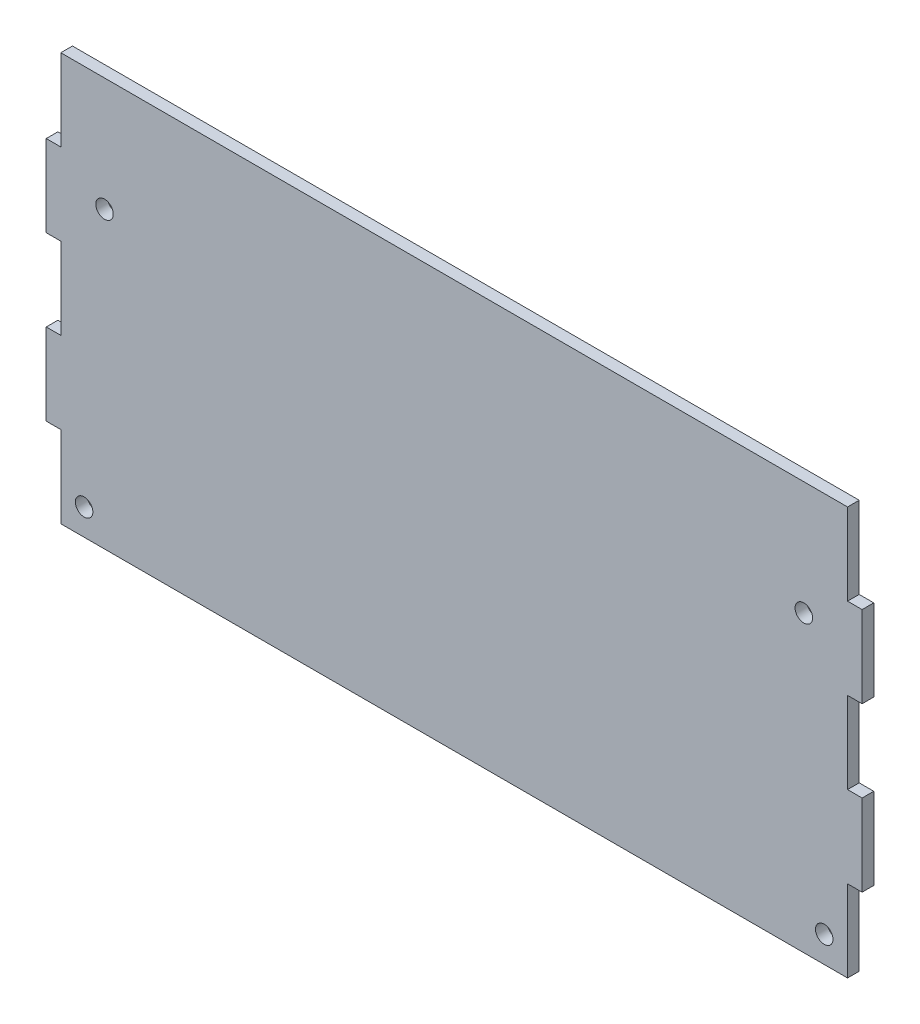
ISO-10303-21;
HEADER;
FILE_DESCRIPTION(('STEP AP214'),'2;1');
FILE_NAME('part.step','',(''),(''),'','','');
FILE_SCHEMA(('AUTOMOTIVE_DESIGN { 1 0 10303 214 1 1 1 1 }'));
ENDSEC;
DATA;
#1=APPLICATION_CONTEXT('core data for automotive mechanical design processes');
#2=APPLICATION_PROTOCOL_DEFINITION('international standard','automotive_design',2000,#1);
#3=PRODUCT_CONTEXT('',#1,'mechanical');
#4=PRODUCT('Part','Part','',(#3));
#5=PRODUCT_RELATED_PRODUCT_CATEGORY('part','',(#4));
#6=PRODUCT_DEFINITION_FORMATION('','',#4);
#7=PRODUCT_DEFINITION_CONTEXT('part definition',#1,'design');
#8=PRODUCT_DEFINITION('design','',#6,#7);
#9=PRODUCT_DEFINITION_SHAPE('','',#8);
#10=(LENGTH_UNIT() NAMED_UNIT(*) SI_UNIT(.MILLI.,.METRE.));
#11=(NAMED_UNIT(*) PLANE_ANGLE_UNIT() SI_UNIT($,.RADIAN.));
#12=(NAMED_UNIT(*) SI_UNIT($,.STERADIAN.) SOLID_ANGLE_UNIT());
#13=UNCERTAINTY_MEASURE_WITH_UNIT(LENGTH_MEASURE(1.E-05),#10,'distance_accuracy_value','');
#14=(GEOMETRIC_REPRESENTATION_CONTEXT(3) GLOBAL_UNCERTAINTY_ASSIGNED_CONTEXT((#13)) GLOBAL_UNIT_ASSIGNED_CONTEXT((#10,
#11,#12)) REPRESENTATION_CONTEXT('',''));
#15=CARTESIAN_POINT('',(0.,0.,0.));
#16=DIRECTION('',(0.,0.,1.));
#17=DIRECTION('',(1.,0.,0.));
#18=AXIS2_PLACEMENT_3D('',#15,#16,#17);
#19=CARTESIAN_POINT('',(-135.,55.,4.));
#20=DIRECTION('',(1.,0.,0.));
#21=DIRECTION('',(0.,1.,0.));
#22=AXIS2_PLACEMENT_3D('',#19,#20,#21);
#23=PLANE('',#22);
#24=DIRECTION('',(0.,-1.,0.));
#25=VECTOR('',#24,1.);
#26=CARTESIAN_POINT('',(-135.,55.,4.));
#27=LINE('',#26,#25);
#28=CARTESIAN_POINT('',(-135.,29.0000000000001,4.));
#29=VERTEX_POINT('',#28);
#30=CARTESIAN_POINT('',(-135.,1.0000000000001,4.));
#31=VERTEX_POINT('',#30);
#32=EDGE_CURVE('E48',#29,#31,#27,.T.);
#33=ORIENTED_EDGE('',*,*,#32,.F.);
#34=DIRECTION('',(0.,0.,-1.));
#35=VECTOR('',#34,1.);
#36=CARTESIAN_POINT('',(-135.,29.0000000000001,0.));
#37=LINE('',#36,#35);
#38=CARTESIAN_POINT('',(-135.,29.0000000000001,0.));
#39=VERTEX_POINT('',#38);
#40=EDGE_CURVE('E201',#29,#39,#37,.T.);
#41=ORIENTED_EDGE('',*,*,#40,.T.);
#42=DIRECTION('',(0.,-1.,0.));
#43=VECTOR('',#42,1.);
#44=CARTESIAN_POINT('',(-135.,55.,0.));
#45=LINE('',#44,#43);
#46=CARTESIAN_POINT('',(-135.,1.0000000000001,0.));
#47=VERTEX_POINT('',#46);
#48=EDGE_CURVE('E178',#39,#47,#45,.T.);
#49=ORIENTED_EDGE('',*,*,#48,.T.);
#50=DIRECTION('',(0.,0.,1.));
#51=VECTOR('',#50,1.);
#52=CARTESIAN_POINT('',(-135.,1.0000000000001,0.));
#53=LINE('',#52,#51);
#54=EDGE_CURVE('E213',#47,#31,#53,.T.);
#55=ORIENTED_EDGE('',*,*,#54,.T.);
#56=EDGE_LOOP('',(#33,#41,#49,#55));
#57=FACE_BOUND('',#56,.T.);
#58=ADVANCED_FACE('F33',(#57),#23,.F.);
#59=CARTESIAN_POINT('',(-135.,85.,0.));
#60=VERTEX_POINT('',#59);
#61=CARTESIAN_POINT('',(-135.,57.0000000000001,0.));
#62=VERTEX_POINT('',#61);
#63=EDGE_CURVE('E335',#60,#62,#45,.T.);
#64=ORIENTED_EDGE('',*,*,#63,.T.);
#65=DIRECTION('',(0.,0.,1.));
#66=VECTOR('',#65,1.);
#67=CARTESIAN_POINT('',(-135.,57.0000000000001,0.));
#68=LINE('',#67,#66);
#69=CARTESIAN_POINT('',(-135.,57.0000000000001,4.));
#70=VERTEX_POINT('',#69);
#71=EDGE_CURVE('E56',#62,#70,#68,.T.);
#72=ORIENTED_EDGE('',*,*,#71,.T.);
#73=CARTESIAN_POINT('',(-135.,85.,4.));
#74=VERTEX_POINT('',#73);
#75=EDGE_CURVE('E325',#74,#70,#27,.T.);
#76=ORIENTED_EDGE('',*,*,#75,.F.);
#77=DIRECTION('',(0.,0.,1.));
#78=VECTOR('',#77,1.);
#79=CARTESIAN_POINT('',(-135.,85.,0.));
#80=LINE('',#79,#78);
#81=EDGE_CURVE('E294',#60,#74,#80,.T.);
#82=ORIENTED_EDGE('',*,*,#81,.F.);
#83=EDGE_LOOP('',(#64,#72,#76,#82));
#84=FACE_BOUND('',#83,.T.);
#85=ADVANCED_FACE('F390',(#84),#23,.F.);
#86=CARTESIAN_POINT('',(135.,55.,4.));
#87=DIRECTION('',(-1.,0.,0.));
#88=DIRECTION('',(0.,-1.,0.));
#89=AXIS2_PLACEMENT_3D('',#86,#87,#88);
#90=PLANE('',#89);
#91=DIRECTION('',(0.,0.,1.));
#92=VECTOR('',#91,1.);
#93=CARTESIAN_POINT('',(135.,57.,0.));
#94=LINE('',#93,#92);
#95=CARTESIAN_POINT('',(135.,57.,0.));
#96=VERTEX_POINT('',#95);
#97=CARTESIAN_POINT('',(135.,57.,4.));
#98=VERTEX_POINT('',#97);
#99=EDGE_CURVE('E234',#96,#98,#94,.T.);
#100=ORIENTED_EDGE('',*,*,#99,.F.);
#101=DIRECTION('',(0.,1.,0.));
#102=VECTOR('',#101,1.);
#103=CARTESIAN_POINT('',(135.,55.,0.));
#104=LINE('',#103,#102);
#105=CARTESIAN_POINT('',(135.,85.,0.));
#106=VERTEX_POINT('',#105);
#107=EDGE_CURVE('E339',#96,#106,#104,.T.);
#108=ORIENTED_EDGE('',*,*,#107,.T.);
#109=DIRECTION('',(0.,0.,-1.));
#110=VECTOR('',#109,1.);
#111=CARTESIAN_POINT('',(135.,85.,4.));
#112=LINE('',#111,#110);
#113=CARTESIAN_POINT('',(135.,85.,4.));
#114=VERTEX_POINT('',#113);
#115=EDGE_CURVE('E288',#114,#106,#112,.T.);
#116=ORIENTED_EDGE('',*,*,#115,.F.);
#117=DIRECTION('',(0.,1.,0.));
#118=VECTOR('',#117,1.);
#119=CARTESIAN_POINT('',(135.,55.,4.));
#120=LINE('',#119,#118);
#121=EDGE_CURVE('E330',#98,#114,#120,.T.);
#122=ORIENTED_EDGE('',*,*,#121,.F.);
#123=EDGE_LOOP('',(#100,#108,#116,#122));
#124=FACE_BOUND('',#123,.T.);
#125=ADVANCED_FACE('F394',(#124),#90,.F.);
#126=DIRECTION('',(0.,0.,-1.));
#127=VECTOR('',#126,1.);
#128=CARTESIAN_POINT('',(135.,29.,0.));
#129=LINE('',#128,#127);
#130=CARTESIAN_POINT('',(135.,29.,4.));
#131=VERTEX_POINT('',#130);
#132=CARTESIAN_POINT('',(135.,29.,0.));
#133=VERTEX_POINT('',#132);
#134=EDGE_CURVE('E239',#131,#133,#129,.T.);
#135=ORIENTED_EDGE('',*,*,#134,.F.);
#136=CARTESIAN_POINT('',(135.,1.00000000000003,4.));
#137=VERTEX_POINT('',#136);
#138=EDGE_CURVE('E334',#137,#131,#120,.T.);
#139=ORIENTED_EDGE('',*,*,#138,.F.);
#140=DIRECTION('',(0.,0.,1.));
#141=VECTOR('',#140,1.);
#142=CARTESIAN_POINT('',(135.,1.00000000000003,0.));
#143=LINE('',#142,#141);
#144=CARTESIAN_POINT('',(135.,1.00000000000003,0.));
#145=VERTEX_POINT('',#144);
#146=EDGE_CURVE('E261',#145,#137,#143,.T.);
#147=ORIENTED_EDGE('',*,*,#146,.F.);
#148=EDGE_CURVE('E341',#145,#133,#104,.T.);
#149=ORIENTED_EDGE('',*,*,#148,.T.);
#150=EDGE_LOOP('',(#135,#139,#147,#149));
#151=FACE_BOUND('',#150,.T.);
#152=ADVANCED_FACE('F400',(#151),#90,.F.);
#153=DIRECTION('',(0.,0.,-1.));
#154=VECTOR('',#153,1.);
#155=CARTESIAN_POINT('',(135.,-27.,0.));
#156=LINE('',#155,#154);
#157=CARTESIAN_POINT('',(135.,-27.,4.));
#158=VERTEX_POINT('',#157);
#159=CARTESIAN_POINT('',(135.,-27.,0.));
#160=VERTEX_POINT('',#159);
#161=EDGE_CURVE('E266',#158,#160,#156,.T.);
#162=ORIENTED_EDGE('',*,*,#161,.F.);
#163=CARTESIAN_POINT('',(135.,-55.,4.));
#164=VERTEX_POINT('',#163);
#165=EDGE_CURVE('E331',#164,#158,#120,.T.);
#166=ORIENTED_EDGE('',*,*,#165,.F.);
#167=DIRECTION('',(0.,0.,-1.));
#168=VECTOR('',#167,1.);
#169=CARTESIAN_POINT('',(135.,-55.,4.));
#170=LINE('',#169,#168);
#171=CARTESIAN_POINT('',(135.,-55.,0.));
#172=VERTEX_POINT('',#171);
#173=EDGE_CURVE('E41',#164,#172,#170,.T.);
#174=ORIENTED_EDGE('',*,*,#173,.T.);
#175=EDGE_CURVE('E340',#172,#160,#104,.T.);
#176=ORIENTED_EDGE('',*,*,#175,.T.);
#177=EDGE_LOOP('',(#162,#166,#174,#176));
#178=FACE_BOUND('',#177,.T.);
#179=ADVANCED_FACE('F347',(#178),#90,.F.);
#180=CARTESIAN_POINT('',(-135.,-26.9999999999999,4.));
#181=VERTEX_POINT('',#180);
#182=CARTESIAN_POINT('',(-135.,-55.,4.));
#183=VERTEX_POINT('',#182);
#184=EDGE_CURVE('E328',#181,#183,#27,.T.);
#185=ORIENTED_EDGE('',*,*,#184,.F.);
#186=DIRECTION('',(0.,0.,-1.));
#187=VECTOR('',#186,1.);
#188=CARTESIAN_POINT('',(-135.,-26.9999999999999,0.));
#189=LINE('',#188,#187);
#190=CARTESIAN_POINT('',(-135.,-26.9999999999999,0.));
#191=VERTEX_POINT('',#190);
#192=EDGE_CURVE('E182',#181,#191,#189,.T.);
#193=ORIENTED_EDGE('',*,*,#192,.T.);
#194=CARTESIAN_POINT('',(-135.,-55.,0.));
#195=VERTEX_POINT('',#194);
#196=EDGE_CURVE('E322',#191,#195,#45,.T.);
#197=ORIENTED_EDGE('',*,*,#196,.T.);
#198=DIRECTION('',(0.,0.,-1.));
#199=VECTOR('',#198,1.);
#200=CARTESIAN_POINT('',(-135.,-55.,4.));
#201=LINE('',#200,#199);
#202=EDGE_CURVE('E11',#183,#195,#201,.T.);
#203=ORIENTED_EDGE('',*,*,#202,.F.);
#204=EDGE_LOOP('',(#185,#193,#197,#203));
#205=FACE_BOUND('',#204,.T.);
#206=ADVANCED_FACE('F35',(#205),#23,.F.);
#207=CARTESIAN_POINT('',(135.,-55.,4.));
#208=DIRECTION('',(0.,1.,0.));
#209=DIRECTION('',(-1.,0.,0.));
#210=AXIS2_PLACEMENT_3D('',#207,#208,#209);
#211=PLANE('',#210);
#212=DIRECTION('',(1.,0.,0.));
#213=VECTOR('',#212,1.);
#214=CARTESIAN_POINT('',(135.,-55.,0.));
#215=LINE('',#214,#213);
#216=EDGE_CURVE('E337',#195,#172,#215,.T.);
#217=ORIENTED_EDGE('',*,*,#216,.T.);
#218=ORIENTED_EDGE('',*,*,#173,.F.);
#219=DIRECTION('',(1.,0.,0.));
#220=VECTOR('',#219,1.);
#221=CARTESIAN_POINT('',(135.,-55.,4.));
#222=LINE('',#221,#220);
#223=EDGE_CURVE('E327',#183,#164,#222,.T.);
#224=ORIENTED_EDGE('',*,*,#223,.F.);
#225=ORIENTED_EDGE('',*,*,#202,.T.);
#226=EDGE_LOOP('',(#217,#218,#224,#225));
#227=FACE_BOUND('',#226,.T.);
#228=ADVANCED_FACE('F364',(#227),#211,.F.);
#229=CARTESIAN_POINT('',(0.,0.,4.));
#230=DIRECTION('',(0.,0.,-1.));
#231=DIRECTION('',(-1.,0.,0.));
#232=AXIS2_PLACEMENT_3D('',#229,#230,#231);
#233=PLANE('',#232);
#234=CARTESIAN_POINT('',(127.,-45.9999999999999,4.));
#235=DIRECTION('',(0.,0.,-1.));
#236=DIRECTION('',(-1.,0.,0.));
#237=AXIS2_PLACEMENT_3D('',#234,#235,#236);
#238=CIRCLE('',#237,3.00000000000001);
#239=CARTESIAN_POINT('',(124.,-45.9999999999999,4.));
#240=VERTEX_POINT('',#239);
#241=EDGE_CURVE('E301',#240,#240,#238,.T.);
#242=ORIENTED_EDGE('',*,*,#241,.T.);
#243=EDGE_LOOP('',(#242));
#244=FACE_BOUND('',#243,.T.);
#245=CARTESIAN_POINT('',(-120.,46.,4.));
#246=DIRECTION('',(0.,0.,-1.));
#247=DIRECTION('',(-1.,0.,0.));
#248=AXIS2_PLACEMENT_3D('',#245,#246,#247);
#249=CIRCLE('',#248,2.99999999999999);
#250=CARTESIAN_POINT('',(-123.,46.,4.));
#251=VERTEX_POINT('',#250);
#252=EDGE_CURVE('E308',#251,#251,#249,.T.);
#253=ORIENTED_EDGE('',*,*,#252,.T.);
#254=EDGE_LOOP('',(#253));
#255=FACE_BOUND('',#254,.T.);
#256=CARTESIAN_POINT('',(-127.,-46.,4.));
#257=DIRECTION('',(0.,0.,-1.));
#258=DIRECTION('',(-1.,0.,0.));
#259=AXIS2_PLACEMENT_3D('',#256,#257,#258);
#260=CIRCLE('',#259,2.99999999999999);
#261=CARTESIAN_POINT('',(-130.,-46.,4.));
#262=VERTEX_POINT('',#261);
#263=EDGE_CURVE('E314',#262,#262,#260,.T.);
#264=ORIENTED_EDGE('',*,*,#263,.T.);
#265=EDGE_LOOP('',(#264));
#266=FACE_BOUND('',#265,.T.);
#267=CARTESIAN_POINT('',(120.,46.0000000000001,4.));
#268=DIRECTION('',(0.,0.,-1.));
#269=DIRECTION('',(-1.,0.,0.));
#270=AXIS2_PLACEMENT_3D('',#267,#268,#269);
#271=CIRCLE('',#270,3.00000000000001);
#272=CARTESIAN_POINT('',(117.,46.0000000000001,4.));
#273=VERTEX_POINT('',#272);
#274=EDGE_CURVE('E319',#273,#273,#271,.T.);
#275=ORIENTED_EDGE('',*,*,#274,.T.);
#276=EDGE_LOOP('',(#275));
#277=FACE_BOUND('',#276,.T.);
#278=ORIENTED_EDGE('',*,*,#75,.T.);
#279=DIRECTION('',(1.,0.,0.));
#280=VECTOR('',#279,1.);
#281=CARTESIAN_POINT('',(-140.,57.0000000000001,4.));
#282=LINE('',#281,#280);
#283=CARTESIAN_POINT('',(-140.,57.0000000000001,4.));
#284=VERTEX_POINT('',#283);
#285=EDGE_CURVE('E205',#284,#70,#282,.T.);
#286=ORIENTED_EDGE('',*,*,#285,.F.);
#287=DIRECTION('',(0.,-1.,0.));
#288=VECTOR('',#287,1.);
#289=CARTESIAN_POINT('',(-140.,29.0000000000001,4.));
#290=LINE('',#289,#288);
#291=CARTESIAN_POINT('',(-140.,29.0000000000001,4.));
#292=VERTEX_POINT('',#291);
#293=EDGE_CURVE('E195',#284,#292,#290,.T.);
#294=ORIENTED_EDGE('',*,*,#293,.T.);
#295=DIRECTION('',(1.,0.,0.));
#296=VECTOR('',#295,1.);
#297=CARTESIAN_POINT('',(-140.,29.0000000000001,4.));
#298=LINE('',#297,#296);
#299=EDGE_CURVE('E183',#292,#29,#298,.T.);
#300=ORIENTED_EDGE('',*,*,#299,.T.);
#301=ORIENTED_EDGE('',*,*,#32,.T.);
#302=DIRECTION('',(1.,0.,0.));
#303=VECTOR('',#302,1.);
#304=CARTESIAN_POINT('',(-140.,1.0000000000001,4.));
#305=LINE('',#304,#303);
#306=CARTESIAN_POINT('',(-140.,1.0000000000001,4.));
#307=VERTEX_POINT('',#306);
#308=EDGE_CURVE('E227',#307,#31,#305,.T.);
#309=ORIENTED_EDGE('',*,*,#308,.F.);
#310=DIRECTION('',(0.,-1.,0.));
#311=VECTOR('',#310,1.);
#312=CARTESIAN_POINT('',(-140.,-26.9999999999999,4.));
#313=LINE('',#312,#311);
#314=CARTESIAN_POINT('',(-140.,-26.9999999999999,4.));
#315=VERTEX_POINT('',#314);
#316=EDGE_CURVE('E216',#307,#315,#313,.T.);
#317=ORIENTED_EDGE('',*,*,#316,.T.);
#318=DIRECTION('',(1.,0.,0.));
#319=VECTOR('',#318,1.);
#320=CARTESIAN_POINT('',(-140.,-26.9999999999999,4.));
#321=LINE('',#320,#319);
#322=EDGE_CURVE('E230',#315,#181,#321,.T.);
#323=ORIENTED_EDGE('',*,*,#322,.T.);
#324=ORIENTED_EDGE('',*,*,#184,.T.);
#325=ORIENTED_EDGE('',*,*,#223,.T.);
#326=ORIENTED_EDGE('',*,*,#165,.T.);
#327=DIRECTION('',(-1.,0.,0.));
#328=VECTOR('',#327,1.);
#329=CARTESIAN_POINT('',(140.,-27.,4.));
#330=LINE('',#329,#328);
#331=CARTESIAN_POINT('',(140.,-27.,4.));
#332=VERTEX_POINT('',#331);
#333=EDGE_CURVE('E279',#332,#158,#330,.T.);
#334=ORIENTED_EDGE('',*,*,#333,.F.);
#335=DIRECTION('',(0.,-1.,0.));
#336=VECTOR('',#335,1.);
#337=CARTESIAN_POINT('',(140.,-27.,4.));
#338=LINE('',#337,#336);
#339=CARTESIAN_POINT('',(140.,1.00000000000003,4.));
#340=VERTEX_POINT('',#339);
#341=EDGE_CURVE('E268',#340,#332,#338,.T.);
#342=ORIENTED_EDGE('',*,*,#341,.F.);
#343=DIRECTION('',(-1.,0.,0.));
#344=VECTOR('',#343,1.);
#345=CARTESIAN_POINT('',(140.,1.00000000000003,4.));
#346=LINE('',#345,#344);
#347=EDGE_CURVE('E282',#340,#137,#346,.T.);
#348=ORIENTED_EDGE('',*,*,#347,.T.);
#349=ORIENTED_EDGE('',*,*,#138,.T.);
#350=DIRECTION('',(-1.,0.,0.));
#351=VECTOR('',#350,1.);
#352=CARTESIAN_POINT('',(140.,29.,4.));
#353=LINE('',#352,#351);
#354=CARTESIAN_POINT('',(140.,29.,4.));
#355=VERTEX_POINT('',#354);
#356=EDGE_CURVE('E252',#355,#131,#353,.T.);
#357=ORIENTED_EDGE('',*,*,#356,.F.);
#358=DIRECTION('',(0.,-1.,0.));
#359=VECTOR('',#358,1.);
#360=CARTESIAN_POINT('',(140.,29.,4.));
#361=LINE('',#360,#359);
#362=CARTESIAN_POINT('',(140.,57.,4.));
#363=VERTEX_POINT('',#362);
#364=EDGE_CURVE('E241',#363,#355,#361,.T.);
#365=ORIENTED_EDGE('',*,*,#364,.F.);
#366=DIRECTION('',(-1.,0.,0.));
#367=VECTOR('',#366,1.);
#368=CARTESIAN_POINT('',(140.,57.,4.));
#369=LINE('',#368,#367);
#370=EDGE_CURVE('E255',#363,#98,#369,.T.);
#371=ORIENTED_EDGE('',*,*,#370,.T.);
#372=ORIENTED_EDGE('',*,*,#121,.T.);
#373=DIRECTION('',(1.,0.,0.));
#374=VECTOR('',#373,1.);
#375=CARTESIAN_POINT('',(-135.,85.,4.));
#376=LINE('',#375,#374);
#377=EDGE_CURVE('E297',#74,#114,#376,.T.);
#378=ORIENTED_EDGE('',*,*,#377,.F.);
#379=EDGE_LOOP('',(#278,#286,#294,#300,#301,#309,#317,#323,#324,#325,#326,#334,#342,#348,#349,
#357,#365,#371,#372,#378));
#380=FACE_BOUND('',#379,.T.);
#381=ADVANCED_FACE('F360',(#244,#255,#266,#277,#380),#233,.F.);
#382=CARTESIAN_POINT('',(0.,0.,0.));
#383=DIRECTION('',(0.,0.,-1.));
#384=DIRECTION('',(-1.,0.,0.));
#385=AXIS2_PLACEMENT_3D('',#382,#383,#384);
#386=PLANE('',#385);
#387=CARTESIAN_POINT('',(127.,-45.9999999999999,0.));
#388=DIRECTION('',(0.,0.,-1.));
#389=DIRECTION('',(-1.,0.,0.));
#390=AXIS2_PLACEMENT_3D('',#387,#388,#389);
#391=CIRCLE('',#390,3.00000000000001);
#392=CARTESIAN_POINT('',(124.,-45.9999999999999,0.));
#393=VERTEX_POINT('',#392);
#394=EDGE_CURVE('E305',#393,#393,#391,.T.);
#395=ORIENTED_EDGE('',*,*,#394,.F.);
#396=EDGE_LOOP('',(#395));
#397=FACE_BOUND('',#396,.T.);
#398=CARTESIAN_POINT('',(-120.,46.,0.));
#399=DIRECTION('',(0.,0.,-1.));
#400=DIRECTION('',(-1.,0.,0.));
#401=AXIS2_PLACEMENT_3D('',#398,#399,#400);
#402=CIRCLE('',#401,2.99999999999999);
#403=CARTESIAN_POINT('',(-123.,46.,0.));
#404=VERTEX_POINT('',#403);
#405=EDGE_CURVE('E311',#404,#404,#402,.T.);
#406=ORIENTED_EDGE('',*,*,#405,.F.);
#407=EDGE_LOOP('',(#406));
#408=FACE_BOUND('',#407,.T.);
#409=CARTESIAN_POINT('',(-127.,-46.,0.));
#410=DIRECTION('',(0.,0.,-1.));
#411=DIRECTION('',(-1.,0.,0.));
#412=AXIS2_PLACEMENT_3D('',#409,#410,#411);
#413=CIRCLE('',#412,2.99999999999999);
#414=CARTESIAN_POINT('',(-130.,-46.,0.));
#415=VERTEX_POINT('',#414);
#416=EDGE_CURVE('E300',#415,#415,#413,.T.);
#417=ORIENTED_EDGE('',*,*,#416,.F.);
#418=EDGE_LOOP('',(#417));
#419=FACE_BOUND('',#418,.T.);
#420=CARTESIAN_POINT('',(120.,46.0000000000001,0.));
#421=DIRECTION('',(0.,0.,-1.));
#422=DIRECTION('',(-1.,0.,0.));
#423=AXIS2_PLACEMENT_3D('',#420,#421,#422);
#424=CIRCLE('',#423,3.00000000000001);
#425=CARTESIAN_POINT('',(117.,46.0000000000001,0.));
#426=VERTEX_POINT('',#425);
#427=EDGE_CURVE('E304',#426,#426,#424,.T.);
#428=ORIENTED_EDGE('',*,*,#427,.F.);
#429=EDGE_LOOP('',(#428));
#430=FACE_BOUND('',#429,.T.);
#431=ORIENTED_EDGE('',*,*,#63,.F.);
#432=DIRECTION('',(-1.,0.,0.));
#433=VECTOR('',#432,1.);
#434=CARTESIAN_POINT('',(135.,85.,0.));
#435=LINE('',#434,#433);
#436=EDGE_CURVE('E291',#106,#60,#435,.T.);
#437=ORIENTED_EDGE('',*,*,#436,.F.);
#438=ORIENTED_EDGE('',*,*,#107,.F.);
#439=DIRECTION('',(-1.,0.,0.));
#440=VECTOR('',#439,1.);
#441=CARTESIAN_POINT('',(140.,57.,0.));
#442=LINE('',#441,#440);
#443=CARTESIAN_POINT('',(140.,57.,0.));
#444=VERTEX_POINT('',#443);
#445=EDGE_CURVE('E258',#444,#96,#442,.T.);
#446=ORIENTED_EDGE('',*,*,#445,.F.);
#447=DIRECTION('',(0.,1.,0.));
#448=VECTOR('',#447,1.);
#449=CARTESIAN_POINT('',(140.,29.,0.));
#450=LINE('',#449,#448);
#451=CARTESIAN_POINT('',(140.,29.,0.));
#452=VERTEX_POINT('',#451);
#453=EDGE_CURVE('E235',#452,#444,#450,.T.);
#454=ORIENTED_EDGE('',*,*,#453,.F.);
#455=DIRECTION('',(-1.,0.,0.));
#456=VECTOR('',#455,1.);
#457=CARTESIAN_POINT('',(140.,29.,0.));
#458=LINE('',#457,#456);
#459=EDGE_CURVE('E245',#452,#133,#458,.T.);
#460=ORIENTED_EDGE('',*,*,#459,.T.);
#461=ORIENTED_EDGE('',*,*,#148,.F.);
#462=DIRECTION('',(-1.,0.,0.));
#463=VECTOR('',#462,1.);
#464=CARTESIAN_POINT('',(140.,1.00000000000003,0.));
#465=LINE('',#464,#463);
#466=CARTESIAN_POINT('',(140.,1.00000000000003,0.));
#467=VERTEX_POINT('',#466);
#468=EDGE_CURVE('E285',#467,#145,#465,.T.);
#469=ORIENTED_EDGE('',*,*,#468,.F.);
#470=DIRECTION('',(0.,1.,0.));
#471=VECTOR('',#470,1.);
#472=CARTESIAN_POINT('',(140.,-27.,0.));
#473=LINE('',#472,#471);
#474=CARTESIAN_POINT('',(140.,-27.,0.));
#475=VERTEX_POINT('',#474);
#476=EDGE_CURVE('E262',#475,#467,#473,.T.);
#477=ORIENTED_EDGE('',*,*,#476,.F.);
#478=DIRECTION('',(-1.,0.,0.));
#479=VECTOR('',#478,1.);
#480=CARTESIAN_POINT('',(140.,-27.,0.));
#481=LINE('',#480,#479);
#482=EDGE_CURVE('E272',#475,#160,#481,.T.);
#483=ORIENTED_EDGE('',*,*,#482,.T.);
#484=ORIENTED_EDGE('',*,*,#175,.F.);
#485=ORIENTED_EDGE('',*,*,#216,.F.);
#486=ORIENTED_EDGE('',*,*,#196,.F.);
#487=DIRECTION('',(1.,0.,0.));
#488=VECTOR('',#487,1.);
#489=CARTESIAN_POINT('',(-140.,-26.9999999999999,0.));
#490=LINE('',#489,#488);
#491=CARTESIAN_POINT('',(-140.,-26.9999999999999,0.));
#492=VERTEX_POINT('',#491);
#493=EDGE_CURVE('E232',#492,#191,#490,.T.);
#494=ORIENTED_EDGE('',*,*,#493,.F.);
#495=DIRECTION('',(0.,1.,0.));
#496=VECTOR('',#495,1.);
#497=CARTESIAN_POINT('',(-140.,-26.9999999999999,0.));
#498=LINE('',#497,#496);
#499=CARTESIAN_POINT('',(-140.,1.0000000000001,0.));
#500=VERTEX_POINT('',#499);
#501=EDGE_CURVE('E209',#492,#500,#498,.T.);
#502=ORIENTED_EDGE('',*,*,#501,.T.);
#503=DIRECTION('',(1.,0.,0.));
#504=VECTOR('',#503,1.);
#505=CARTESIAN_POINT('',(-140.,1.0000000000001,0.));
#506=LINE('',#505,#504);
#507=EDGE_CURVE('E222',#500,#47,#506,.T.);
#508=ORIENTED_EDGE('',*,*,#507,.T.);
#509=ORIENTED_EDGE('',*,*,#48,.F.);
#510=DIRECTION('',(1.,0.,0.));
#511=VECTOR('',#510,1.);
#512=CARTESIAN_POINT('',(-140.,29.0000000000001,0.));
#513=LINE('',#512,#511);
#514=CARTESIAN_POINT('',(-140.,29.0000000000001,0.));
#515=VERTEX_POINT('',#514);
#516=EDGE_CURVE('E171',#515,#39,#513,.T.);
#517=ORIENTED_EDGE('',*,*,#516,.F.);
#518=DIRECTION('',(0.,1.,0.));
#519=VECTOR('',#518,1.);
#520=CARTESIAN_POINT('',(-140.,29.0000000000001,0.));
#521=LINE('',#520,#519);
#522=CARTESIAN_POINT('',(-140.,57.0000000000001,0.));
#523=VERTEX_POINT('',#522);
#524=EDGE_CURVE('E175',#515,#523,#521,.T.);
#525=ORIENTED_EDGE('',*,*,#524,.T.);
#526=DIRECTION('',(1.,0.,0.));
#527=VECTOR('',#526,1.);
#528=CARTESIAN_POINT('',(-140.,57.0000000000001,0.));
#529=LINE('',#528,#527);
#530=EDGE_CURVE('E200',#523,#62,#529,.T.);
#531=ORIENTED_EDGE('',*,*,#530,.T.);
#532=EDGE_LOOP('',(#431,#437,#438,#446,#454,#460,#461,#469,#477,#483,#484,#485,#486,#494,#502,
#508,#509,#517,#525,#531));
#533=FACE_BOUND('',#532,.T.);
#534=ADVANCED_FACE('F173',(#397,#408,#419,#430,#533),#386,.T.);
#535=CARTESIAN_POINT('',(120.,46.0000000000001,4.));
#536=DIRECTION('',(0.,0.,-1.));
#537=DIRECTION('',(-1.,0.,0.));
#538=AXIS2_PLACEMENT_3D('',#535,#536,#537);
#539=CYLINDRICAL_SURFACE('',#538,3.00000000000001);
#540=ORIENTED_EDGE('',*,*,#274,.F.);
#541=EDGE_LOOP('',(#540));
#542=FACE_BOUND('',#541,.T.);
#543=ORIENTED_EDGE('',*,*,#427,.T.);
#544=EDGE_LOOP('',(#543));
#545=FACE_BOUND('',#544,.T.);
#546=ADVANCED_FACE('F481',(#542,#545),#539,.F.);
#547=CARTESIAN_POINT('',(-127.,-46.,4.));
#548=DIRECTION('',(0.,0.,-1.));
#549=DIRECTION('',(-1.,0.,0.));
#550=AXIS2_PLACEMENT_3D('',#547,#548,#549);
#551=CYLINDRICAL_SURFACE('',#550,2.99999999999999);
#552=ORIENTED_EDGE('',*,*,#263,.F.);
#553=EDGE_LOOP('',(#552));
#554=FACE_BOUND('',#553,.T.);
#555=ORIENTED_EDGE('',*,*,#416,.T.);
#556=EDGE_LOOP('',(#555));
#557=FACE_BOUND('',#556,.T.);
#558=ADVANCED_FACE('F610',(#554,#557),#551,.F.);
#559=CARTESIAN_POINT('',(-120.,46.,4.));
#560=DIRECTION('',(0.,0.,-1.));
#561=DIRECTION('',(-1.,0.,0.));
#562=AXIS2_PLACEMENT_3D('',#559,#560,#561);
#563=CYLINDRICAL_SURFACE('',#562,2.99999999999999);
#564=ORIENTED_EDGE('',*,*,#252,.F.);
#565=EDGE_LOOP('',(#564));
#566=FACE_BOUND('',#565,.T.);
#567=ORIENTED_EDGE('',*,*,#405,.T.);
#568=EDGE_LOOP('',(#567));
#569=FACE_BOUND('',#568,.T.);
#570=ADVANCED_FACE('F600',(#566,#569),#563,.F.);
#571=CARTESIAN_POINT('',(127.,-45.9999999999999,4.));
#572=DIRECTION('',(0.,0.,-1.));
#573=DIRECTION('',(-1.,0.,0.));
#574=AXIS2_PLACEMENT_3D('',#571,#572,#573);
#575=CYLINDRICAL_SURFACE('',#574,3.00000000000001);
#576=ORIENTED_EDGE('',*,*,#241,.F.);
#577=EDGE_LOOP('',(#576));
#578=FACE_BOUND('',#577,.T.);
#579=ORIENTED_EDGE('',*,*,#394,.T.);
#580=EDGE_LOOP('',(#579));
#581=FACE_BOUND('',#580,.T.);
#582=ADVANCED_FACE('F591',(#578,#581),#575,.F.);
#583=CARTESIAN_POINT('',(0.,85.,0.));
#584=DIRECTION('',(0.,1.,0.));
#585=DIRECTION('',(-1.,0.,0.));
#586=AXIS2_PLACEMENT_3D('',#583,#584,#585);
#587=PLANE('',#586);
#588=ORIENTED_EDGE('',*,*,#115,.T.);
#589=ORIENTED_EDGE('',*,*,#436,.T.);
#590=ORIENTED_EDGE('',*,*,#81,.T.);
#591=ORIENTED_EDGE('',*,*,#377,.T.);
#592=EDGE_LOOP('',(#588,#589,#590,#591));
#593=FACE_BOUND('',#592,.T.);
#594=ADVANCED_FACE('F429',(#593),#587,.T.);
#595=CARTESIAN_POINT('',(140.,1.00000000000003,0.));
#596=DIRECTION('',(0.,-1.,0.));
#597=DIRECTION('',(1.,0.,0.));
#598=AXIS2_PLACEMENT_3D('',#595,#596,#597);
#599=PLANE('',#598);
#600=ORIENTED_EDGE('',*,*,#146,.T.);
#601=ORIENTED_EDGE('',*,*,#347,.F.);
#602=DIRECTION('',(0.,0.,1.));
#603=VECTOR('',#602,1.);
#604=CARTESIAN_POINT('',(140.,1.00000000000003,0.));
#605=LINE('',#604,#603);
#606=EDGE_CURVE('E265',#467,#340,#605,.T.);
#607=ORIENTED_EDGE('',*,*,#606,.F.);
#608=ORIENTED_EDGE('',*,*,#468,.T.);
#609=EDGE_LOOP('',(#600,#601,#607,#608));
#610=FACE_BOUND('',#609,.T.);
#611=ADVANCED_FACE('F555',(#610),#599,.F.);
#612=CARTESIAN_POINT('',(140.,-27.,0.));
#613=DIRECTION('',(0.,1.,0.));
#614=DIRECTION('',(-1.,0.,0.));
#615=AXIS2_PLACEMENT_3D('',#612,#613,#614);
#616=PLANE('',#615);
#617=ORIENTED_EDGE('',*,*,#161,.T.);
#618=ORIENTED_EDGE('',*,*,#482,.F.);
#619=DIRECTION('',(0.,0.,-1.));
#620=VECTOR('',#619,1.);
#621=CARTESIAN_POINT('',(140.,-27.,0.));
#622=LINE('',#621,#620);
#623=EDGE_CURVE('E270',#332,#475,#622,.T.);
#624=ORIENTED_EDGE('',*,*,#623,.F.);
#625=ORIENTED_EDGE('',*,*,#333,.T.);
#626=EDGE_LOOP('',(#617,#618,#624,#625));
#627=FACE_BOUND('',#626,.T.);
#628=ADVANCED_FACE('F357',(#627),#616,.F.);
#629=CARTESIAN_POINT('',(140.,0.,0.));
#630=DIRECTION('',(1.,0.,0.));
#631=DIRECTION('',(0.,0.,-1.));
#632=AXIS2_PLACEMENT_3D('',#629,#630,#631);
#633=PLANE('',#632);
#634=ORIENTED_EDGE('',*,*,#476,.T.);
#635=ORIENTED_EDGE('',*,*,#606,.T.);
#636=ORIENTED_EDGE('',*,*,#341,.T.);
#637=ORIENTED_EDGE('',*,*,#623,.T.);
#638=EDGE_LOOP('',(#634,#635,#636,#637));
#639=FACE_BOUND('',#638,.T.);
#640=ADVANCED_FACE('F537',(#639),#633,.T.);
#641=CARTESIAN_POINT('',(140.,57.,0.));
#642=DIRECTION('',(0.,-1.,0.));
#643=DIRECTION('',(1.,0.,0.));
#644=AXIS2_PLACEMENT_3D('',#641,#642,#643);
#645=PLANE('',#644);
#646=ORIENTED_EDGE('',*,*,#99,.T.);
#647=ORIENTED_EDGE('',*,*,#370,.F.);
#648=DIRECTION('',(0.,0.,1.));
#649=VECTOR('',#648,1.);
#650=CARTESIAN_POINT('',(140.,57.,0.));
#651=LINE('',#650,#649);
#652=EDGE_CURVE('E238',#444,#363,#651,.T.);
#653=ORIENTED_EDGE('',*,*,#652,.F.);
#654=ORIENTED_EDGE('',*,*,#445,.T.);
#655=EDGE_LOOP('',(#646,#647,#653,#654));
#656=FACE_BOUND('',#655,.T.);
#657=ADVANCED_FACE('F417',(#656),#645,.F.);
#658=CARTESIAN_POINT('',(140.,29.,0.));
#659=DIRECTION('',(0.,1.,0.));
#660=DIRECTION('',(0.,0.,1.));
#661=AXIS2_PLACEMENT_3D('',#658,#659,#660);
#662=PLANE('',#661);
#663=ORIENTED_EDGE('',*,*,#134,.T.);
#664=ORIENTED_EDGE('',*,*,#459,.F.);
#665=DIRECTION('',(0.,0.,-1.));
#666=VECTOR('',#665,1.);
#667=CARTESIAN_POINT('',(140.,29.,0.));
#668=LINE('',#667,#666);
#669=EDGE_CURVE('E243',#355,#452,#668,.T.);
#670=ORIENTED_EDGE('',*,*,#669,.F.);
#671=ORIENTED_EDGE('',*,*,#356,.T.);
#672=EDGE_LOOP('',(#663,#664,#670,#671));
#673=FACE_BOUND('',#672,.T.);
#674=ADVANCED_FACE('F386',(#673),#662,.F.);
#675=CARTESIAN_POINT('',(140.,-1.35083142363077E-13,0.));
#676=DIRECTION('',(1.,0.,0.));
#677=DIRECTION('',(0.,1.,0.));
#678=AXIS2_PLACEMENT_3D('',#675,#676,#677);
#679=PLANE('',#678);
#680=ORIENTED_EDGE('',*,*,#453,.T.);
#681=ORIENTED_EDGE('',*,*,#652,.T.);
#682=ORIENTED_EDGE('',*,*,#364,.T.);
#683=ORIENTED_EDGE('',*,*,#669,.T.);
#684=EDGE_LOOP('',(#680,#681,#682,#683));
#685=FACE_BOUND('',#684,.T.);
#686=ADVANCED_FACE('F379',(#685),#679,.T.);
#687=CARTESIAN_POINT('',(-140.,-26.9999999999999,0.));
#688=DIRECTION('',(0.,-1.,0.));
#689=DIRECTION('',(1.,0.,0.));
#690=AXIS2_PLACEMENT_3D('',#687,#688,#689);
#691=PLANE('',#690);
#692=ORIENTED_EDGE('',*,*,#192,.F.);
#693=ORIENTED_EDGE('',*,*,#322,.F.);
#694=DIRECTION('',(0.,0.,-1.));
#695=VECTOR('',#694,1.);
#696=CARTESIAN_POINT('',(-140.,-26.9999999999999,0.));
#697=LINE('',#696,#695);
#698=EDGE_CURVE('E212',#315,#492,#697,.T.);
#699=ORIENTED_EDGE('',*,*,#698,.T.);
#700=ORIENTED_EDGE('',*,*,#493,.T.);
#701=EDGE_LOOP('',(#692,#693,#699,#700));
#702=FACE_BOUND('',#701,.T.);
#703=ADVANCED_FACE('F377',(#702),#691,.T.);
#704=CARTESIAN_POINT('',(-140.,1.0000000000001,0.));
#705=DIRECTION('',(0.,1.,0.));
#706=DIRECTION('',(-1.,0.,0.));
#707=AXIS2_PLACEMENT_3D('',#704,#705,#706);
#708=PLANE('',#707);
#709=ORIENTED_EDGE('',*,*,#54,.F.);
#710=ORIENTED_EDGE('',*,*,#507,.F.);
#711=DIRECTION('',(0.,0.,1.));
#712=VECTOR('',#711,1.);
#713=CARTESIAN_POINT('',(-140.,1.0000000000001,0.));
#714=LINE('',#713,#712);
#715=EDGE_CURVE('E219',#500,#307,#714,.T.);
#716=ORIENTED_EDGE('',*,*,#715,.T.);
#717=ORIENTED_EDGE('',*,*,#308,.T.);
#718=EDGE_LOOP('',(#709,#710,#716,#717));
#719=FACE_BOUND('',#718,.T.);
#720=ADVANCED_FACE('F371',(#719),#708,.T.);
#721=CARTESIAN_POINT('',(-140.,0.,0.));
#722=DIRECTION('',(-1.,0.,0.));
#723=DIRECTION('',(0.,0.,-1.));
#724=AXIS2_PLACEMENT_3D('',#721,#722,#723);
#725=PLANE('',#724);
#726=ORIENTED_EDGE('',*,*,#501,.F.);
#727=ORIENTED_EDGE('',*,*,#698,.F.);
#728=ORIENTED_EDGE('',*,*,#316,.F.);
#729=ORIENTED_EDGE('',*,*,#715,.F.);
#730=EDGE_LOOP('',(#726,#727,#728,#729));
#731=FACE_BOUND('',#730,.T.);
#732=ADVANCED_FACE('F375',(#731),#725,.T.);
#733=CARTESIAN_POINT('',(-140.,29.0000000000001,0.));
#734=DIRECTION('',(0.,-1.,0.));
#735=DIRECTION('',(0.,0.,-1.));
#736=AXIS2_PLACEMENT_3D('',#733,#734,#735);
#737=PLANE('',#736);
#738=ORIENTED_EDGE('',*,*,#40,.F.);
#739=ORIENTED_EDGE('',*,*,#299,.F.);
#740=DIRECTION('',(0.,0.,-1.));
#741=VECTOR('',#740,1.);
#742=CARTESIAN_POINT('',(-140.,29.0000000000001,0.));
#743=LINE('',#742,#741);
#744=EDGE_CURVE('E189',#292,#515,#743,.T.);
#745=ORIENTED_EDGE('',*,*,#744,.T.);
#746=ORIENTED_EDGE('',*,*,#516,.T.);
#747=EDGE_LOOP('',(#738,#739,#745,#746));
#748=FACE_BOUND('',#747,.T.);
#749=ADVANCED_FACE('F194',(#748),#737,.T.);
#750=CARTESIAN_POINT('',(-140.,57.0000000000001,0.));
#751=DIRECTION('',(0.,1.,0.));
#752=DIRECTION('',(-1.,0.,0.));
#753=AXIS2_PLACEMENT_3D('',#750,#751,#752);
#754=PLANE('',#753);
#755=ORIENTED_EDGE('',*,*,#71,.F.);
#756=ORIENTED_EDGE('',*,*,#530,.F.);
#757=DIRECTION('',(0.,0.,1.));
#758=VECTOR('',#757,1.);
#759=CARTESIAN_POINT('',(-140.,57.0000000000001,0.));
#760=LINE('',#759,#758);
#761=EDGE_CURVE('E192',#523,#284,#760,.T.);
#762=ORIENTED_EDGE('',*,*,#761,.T.);
#763=ORIENTED_EDGE('',*,*,#285,.T.);
#764=EDGE_LOOP('',(#755,#756,#762,#763));
#765=FACE_BOUND('',#764,.T.);
#766=ADVANCED_FACE('F432',(#765),#754,.T.);
#767=CARTESIAN_POINT('',(-140.,0.,0.));
#768=DIRECTION('',(-1.,0.,0.));
#769=DIRECTION('',(0.,1.,0.));
#770=AXIS2_PLACEMENT_3D('',#767,#768,#769);
#771=PLANE('',#770);
#772=ORIENTED_EDGE('',*,*,#524,.F.);
#773=ORIENTED_EDGE('',*,*,#744,.F.);
#774=ORIENTED_EDGE('',*,*,#293,.F.);
#775=ORIENTED_EDGE('',*,*,#761,.F.);
#776=EDGE_LOOP('',(#772,#773,#774,#775));
#777=FACE_BOUND('',#776,.T.);
#778=ADVANCED_FACE('F187',(#777),#771,.T.);
#779=CLOSED_SHELL('',(#58,#85,#125,#152,#179,#206,#228,#381,#534,#546,#558,#570,#582,#594,#611,
#628,#640,#657,#674,#686,#703,#720,#732,#749,#766,#778));
#780=MANIFOLD_SOLID_BREP('B2',#779);
#781=ADVANCED_BREP_SHAPE_REPRESENTATION('',(#18,#780),#14);
#782=SHAPE_DEFINITION_REPRESENTATION(#9,#781);
ENDSEC;
END-ISO-10303-21;
